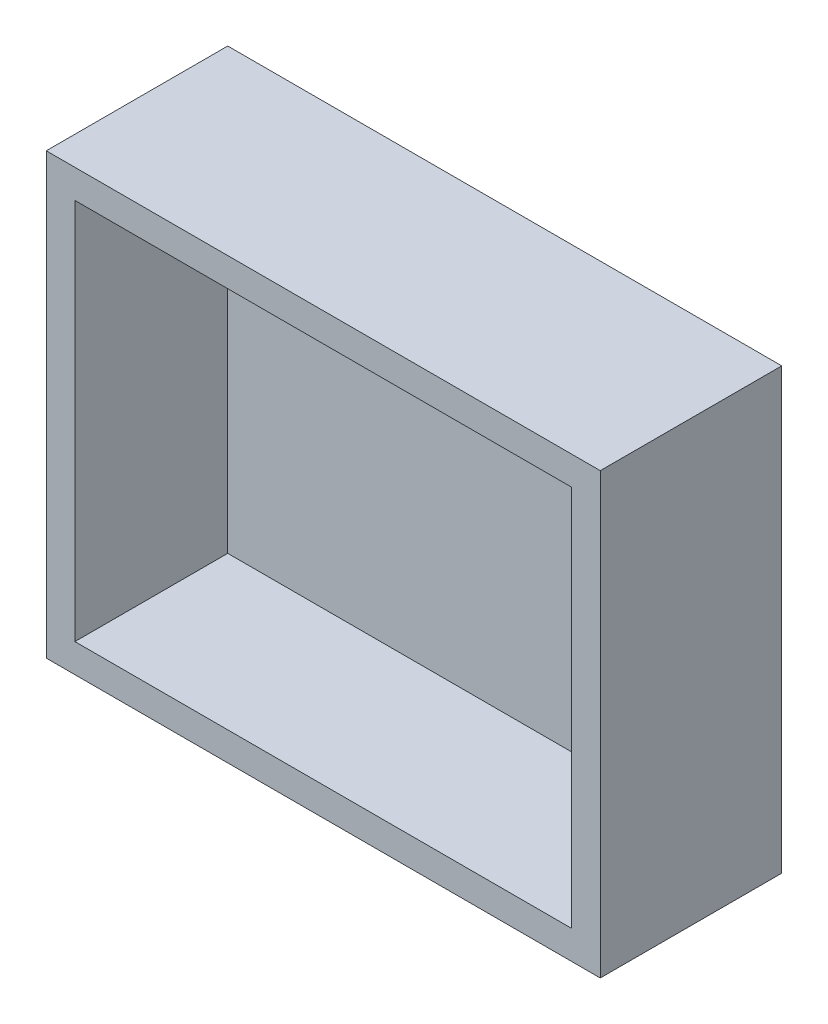
ISO-10303-21;
HEADER;
FILE_DESCRIPTION(('STEP AP214'),'2;1');
FILE_NAME('part.step','',(''),(''),'','','');
FILE_SCHEMA(('AUTOMOTIVE_DESIGN { 1 0 10303 214 1 1 1 1 }'));
ENDSEC;
DATA;
#1=APPLICATION_CONTEXT('core data for automotive mechanical design processes');
#2=APPLICATION_PROTOCOL_DEFINITION('international standard','automotive_design',2000,#1);
#3=PRODUCT_CONTEXT('',#1,'mechanical');
#4=PRODUCT('Part','Part','',(#3));
#5=PRODUCT_RELATED_PRODUCT_CATEGORY('part','',(#4));
#6=PRODUCT_DEFINITION_FORMATION('','',#4);
#7=PRODUCT_DEFINITION_CONTEXT('part definition',#1,'design');
#8=PRODUCT_DEFINITION('design','',#6,#7);
#9=PRODUCT_DEFINITION_SHAPE('','',#8);
#10=(LENGTH_UNIT() NAMED_UNIT(*) SI_UNIT(.MILLI.,.METRE.));
#11=(NAMED_UNIT(*) PLANE_ANGLE_UNIT() SI_UNIT($,.RADIAN.));
#12=(NAMED_UNIT(*) SI_UNIT($,.STERADIAN.) SOLID_ANGLE_UNIT());
#13=UNCERTAINTY_MEASURE_WITH_UNIT(LENGTH_MEASURE(1.E-05),#10,'distance_accuracy_value','');
#14=(GEOMETRIC_REPRESENTATION_CONTEXT(3) GLOBAL_UNCERTAINTY_ASSIGNED_CONTEXT((#13)) GLOBAL_UNIT_ASSIGNED_CONTEXT((#10,
#11,#12)) REPRESENTATION_CONTEXT('',''));
#15=CARTESIAN_POINT('',(0.,0.,0.));
#16=DIRECTION('',(0.,0.,1.));
#17=DIRECTION('',(1.,0.,0.));
#18=AXIS2_PLACEMENT_3D('',#15,#16,#17);
#19=CARTESIAN_POINT('',(0.,0.,80.));
#20=DIRECTION('',(0.,0.,-1.));
#21=DIRECTION('',(-1.,0.,0.));
#22=AXIS2_PLACEMENT_3D('',#19,#20,#21);
#23=PLANE('',#22);
#24=DIRECTION('',(0.,-1.,0.));
#25=VECTOR('',#24,1.);
#26=CARTESIAN_POINT('',(0.,0.,80.));
#27=LINE('',#26,#25);
#28=CARTESIAN_POINT('',(0.,230.,80.));
#29=VERTEX_POINT('',#28);
#30=CARTESIAN_POINT('',(0.,0.,80.));
#31=VERTEX_POINT('',#30);
#32=EDGE_CURVE('E151',#29,#31,#27,.T.);
#33=ORIENTED_EDGE('',*,*,#32,.T.);
#34=DIRECTION('',(1.,0.,0.));
#35=VECTOR('',#34,1.);
#36=CARTESIAN_POINT('',(0.,0.,80.));
#37=LINE('',#36,#35);
#38=CARTESIAN_POINT('',(290.,0.,80.));
#39=VERTEX_POINT('',#38);
#40=EDGE_CURVE('E154',#31,#39,#37,.T.);
#41=ORIENTED_EDGE('',*,*,#40,.T.);
#42=DIRECTION('',(0.,1.,0.));
#43=VECTOR('',#42,1.);
#44=CARTESIAN_POINT('',(290.,0.,80.));
#45=LINE('',#44,#43);
#46=CARTESIAN_POINT('',(290.,230.,80.));
#47=VERTEX_POINT('',#46);
#48=EDGE_CURVE('E105',#39,#47,#45,.T.);
#49=ORIENTED_EDGE('',*,*,#48,.T.);
#50=DIRECTION('',(-1.,0.,0.));
#51=VECTOR('',#50,1.);
#52=CARTESIAN_POINT('',(0.,230.,80.));
#53=LINE('',#52,#51);
#54=EDGE_CURVE('E157',#47,#29,#53,.T.);
#55=ORIENTED_EDGE('',*,*,#54,.T.);
#56=EDGE_LOOP('',(#33,#41,#49,#55));
#57=FACE_BOUND('',#56,.T.);
#58=DIRECTION('',(0.,-1.,0.));
#59=VECTOR('',#58,1.);
#60=CARTESIAN_POINT('',(15.,15.,80.));
#61=LINE('',#60,#59);
#62=CARTESIAN_POINT('',(15.,215.,80.));
#63=VERTEX_POINT('',#62);
#64=CARTESIAN_POINT('',(15.,15.,80.));
#65=VERTEX_POINT('',#64);
#66=EDGE_CURVE('E126',#63,#65,#61,.T.);
#67=ORIENTED_EDGE('',*,*,#66,.F.);
#68=DIRECTION('',(-1.,0.,0.));
#69=VECTOR('',#68,1.);
#70=CARTESIAN_POINT('',(15.,215.,80.));
#71=LINE('',#70,#69);
#72=CARTESIAN_POINT('',(275.,215.,80.));
#73=VERTEX_POINT('',#72);
#74=EDGE_CURVE('E133',#73,#63,#71,.T.);
#75=ORIENTED_EDGE('',*,*,#74,.F.);
#76=DIRECTION('',(0.,1.,0.));
#77=VECTOR('',#76,1.);
#78=CARTESIAN_POINT('',(275.,15.,80.));
#79=LINE('',#78,#77);
#80=CARTESIAN_POINT('',(275.,15.,80.));
#81=VERTEX_POINT('',#80);
#82=EDGE_CURVE('E131',#81,#73,#79,.T.);
#83=ORIENTED_EDGE('',*,*,#82,.F.);
#84=DIRECTION('',(1.,0.,0.));
#85=VECTOR('',#84,1.);
#86=CARTESIAN_POINT('',(15.,15.,80.));
#87=LINE('',#86,#85);
#88=EDGE_CURVE('E128',#65,#81,#87,.T.);
#89=ORIENTED_EDGE('',*,*,#88,.F.);
#90=EDGE_LOOP('',(#67,#75,#83,#89));
#91=FACE_BOUND('',#90,.T.);
#92=ADVANCED_FACE('F34',(#57,#91),#23,.F.);
#93=CARTESIAN_POINT('',(0.,0.,80.));
#94=DIRECTION('',(1.,0.,0.));
#95=DIRECTION('',(0.,0.,-1.));
#96=AXIS2_PLACEMENT_3D('',#93,#94,#95);
#97=PLANE('',#96);
#98=DIRECTION('',(0.,0.,-1.));
#99=VECTOR('',#98,1.);
#100=CARTESIAN_POINT('',(0.,230.,80.));
#101=LINE('',#100,#99);
#102=CARTESIAN_POINT('',(0.,230.,-15.));
#103=VERTEX_POINT('',#102);
#104=EDGE_CURVE('E159',#29,#103,#101,.T.);
#105=ORIENTED_EDGE('',*,*,#104,.T.);
#106=DIRECTION('',(0.,1.,0.));
#107=VECTOR('',#106,1.);
#108=CARTESIAN_POINT('',(0.,0.,-15.));
#109=LINE('',#108,#107);
#110=CARTESIAN_POINT('',(0.,0.,-15.));
#111=VERTEX_POINT('',#110);
#112=EDGE_CURVE('E124',#111,#103,#109,.T.);
#113=ORIENTED_EDGE('',*,*,#112,.F.);
#114=DIRECTION('',(0.,0.,-1.));
#115=VECTOR('',#114,1.);
#116=CARTESIAN_POINT('',(0.,0.,80.));
#117=LINE('',#116,#115);
#118=EDGE_CURVE('E11',#31,#111,#117,.T.);
#119=ORIENTED_EDGE('',*,*,#118,.F.);
#120=ORIENTED_EDGE('',*,*,#32,.F.);
#121=EDGE_LOOP('',(#105,#113,#119,#120));
#122=FACE_BOUND('',#121,.T.);
#123=ADVANCED_FACE('F36',(#122),#97,.F.);
#124=CARTESIAN_POINT('',(0.,0.,80.));
#125=DIRECTION('',(0.,1.,0.));
#126=DIRECTION('',(0.,0.,1.));
#127=AXIS2_PLACEMENT_3D('',#124,#125,#126);
#128=PLANE('',#127);
#129=ORIENTED_EDGE('',*,*,#118,.T.);
#130=DIRECTION('',(1.,0.,0.));
#131=VECTOR('',#130,1.);
#132=CARTESIAN_POINT('',(0.,0.,-15.));
#133=LINE('',#132,#131);
#134=CARTESIAN_POINT('',(290.,0.,-15.));
#135=VERTEX_POINT('',#134);
#136=EDGE_CURVE('E114',#111,#135,#133,.T.);
#137=ORIENTED_EDGE('',*,*,#136,.T.);
#138=DIRECTION('',(0.,0.,-1.));
#139=VECTOR('',#138,1.);
#140=CARTESIAN_POINT('',(290.,0.,80.));
#141=LINE('',#140,#139);
#142=EDGE_CURVE('E42',#39,#135,#141,.T.);
#143=ORIENTED_EDGE('',*,*,#142,.F.);
#144=ORIENTED_EDGE('',*,*,#40,.F.);
#145=EDGE_LOOP('',(#129,#137,#143,#144));
#146=FACE_BOUND('',#145,.T.);
#147=ADVANCED_FACE('F118',(#146),#128,.F.);
#148=CARTESIAN_POINT('',(290.,0.,80.));
#149=DIRECTION('',(-1.,0.,0.));
#150=DIRECTION('',(0.,0.,1.));
#151=AXIS2_PLACEMENT_3D('',#148,#149,#150);
#152=PLANE('',#151);
#153=ORIENTED_EDGE('',*,*,#142,.T.);
#154=DIRECTION('',(0.,1.,0.));
#155=VECTOR('',#154,1.);
#156=CARTESIAN_POINT('',(290.,0.,-15.));
#157=LINE('',#156,#155);
#158=CARTESIAN_POINT('',(290.,230.,-15.));
#159=VERTEX_POINT('',#158);
#160=EDGE_CURVE('E104',#135,#159,#157,.T.);
#161=ORIENTED_EDGE('',*,*,#160,.T.);
#162=DIRECTION('',(0.,0.,-1.));
#163=VECTOR('',#162,1.);
#164=CARTESIAN_POINT('',(290.,230.,80.));
#165=LINE('',#164,#163);
#166=EDGE_CURVE('E108',#47,#159,#165,.T.);
#167=ORIENTED_EDGE('',*,*,#166,.F.);
#168=ORIENTED_EDGE('',*,*,#48,.F.);
#169=EDGE_LOOP('',(#153,#161,#167,#168));
#170=FACE_BOUND('',#169,.T.);
#171=ADVANCED_FACE('F102',(#170),#152,.F.);
#172=CARTESIAN_POINT('',(0.,230.,80.));
#173=DIRECTION('',(0.,-1.,0.));
#174=DIRECTION('',(0.,0.,-1.));
#175=AXIS2_PLACEMENT_3D('',#172,#173,#174);
#176=PLANE('',#175);
#177=ORIENTED_EDGE('',*,*,#166,.T.);
#178=DIRECTION('',(1.,0.,0.));
#179=VECTOR('',#178,1.);
#180=CARTESIAN_POINT('',(0.,230.,-15.));
#181=LINE('',#180,#179);
#182=EDGE_CURVE('E116',#103,#159,#181,.T.);
#183=ORIENTED_EDGE('',*,*,#182,.F.);
#184=ORIENTED_EDGE('',*,*,#104,.F.);
#185=ORIENTED_EDGE('',*,*,#54,.F.);
#186=EDGE_LOOP('',(#177,#183,#184,#185));
#187=FACE_BOUND('',#186,.T.);
#188=ADVANCED_FACE('F163',(#187),#176,.F.);
#189=CARTESIAN_POINT('',(15.,15.,80.));
#190=DIRECTION('',(1.,0.,0.));
#191=DIRECTION('',(0.,0.,-1.));
#192=AXIS2_PLACEMENT_3D('',#189,#190,#191);
#193=PLANE('',#192);
#194=DIRECTION('',(0.,-1.,0.));
#195=VECTOR('',#194,1.);
#196=CARTESIAN_POINT('',(15.,15.,0.));
#197=LINE('',#196,#195);
#198=CARTESIAN_POINT('',(15.,215.,0.));
#199=VERTEX_POINT('',#198);
#200=CARTESIAN_POINT('',(15.,15.,0.));
#201=VERTEX_POINT('',#200);
#202=EDGE_CURVE('E57',#199,#201,#197,.T.);
#203=ORIENTED_EDGE('',*,*,#202,.F.);
#204=DIRECTION('',(0.,0.,-1.));
#205=VECTOR('',#204,1.);
#206=CARTESIAN_POINT('',(15.,215.,80.));
#207=LINE('',#206,#205);
#208=EDGE_CURVE('E135',#63,#199,#207,.T.);
#209=ORIENTED_EDGE('',*,*,#208,.F.);
#210=ORIENTED_EDGE('',*,*,#66,.T.);
#211=DIRECTION('',(0.,0.,-1.));
#212=VECTOR('',#211,1.);
#213=CARTESIAN_POINT('',(15.,15.,80.));
#214=LINE('',#213,#212);
#215=EDGE_CURVE('E149',#65,#201,#214,.T.);
#216=ORIENTED_EDGE('',*,*,#215,.T.);
#217=EDGE_LOOP('',(#203,#209,#210,#216));
#218=FACE_BOUND('',#217,.T.);
#219=ADVANCED_FACE('F179',(#218),#193,.T.);
#220=CARTESIAN_POINT('',(15.,15.,80.));
#221=DIRECTION('',(0.,1.,0.));
#222=DIRECTION('',(0.,0.,1.));
#223=AXIS2_PLACEMENT_3D('',#220,#221,#222);
#224=PLANE('',#223);
#225=DIRECTION('',(1.,0.,0.));
#226=VECTOR('',#225,1.);
#227=CARTESIAN_POINT('',(15.,15.,0.));
#228=LINE('',#227,#226);
#229=CARTESIAN_POINT('',(275.,15.,0.));
#230=VERTEX_POINT('',#229);
#231=EDGE_CURVE('E137',#201,#230,#228,.T.);
#232=ORIENTED_EDGE('',*,*,#231,.F.);
#233=ORIENTED_EDGE('',*,*,#215,.F.);
#234=ORIENTED_EDGE('',*,*,#88,.T.);
#235=DIRECTION('',(0.,0.,-1.));
#236=VECTOR('',#235,1.);
#237=CARTESIAN_POINT('',(275.,15.,80.));
#238=LINE('',#237,#236);
#239=EDGE_CURVE('E147',#81,#230,#238,.T.);
#240=ORIENTED_EDGE('',*,*,#239,.T.);
#241=EDGE_LOOP('',(#232,#233,#234,#240));
#242=FACE_BOUND('',#241,.T.);
#243=ADVANCED_FACE('F198',(#242),#224,.T.);
#244=CARTESIAN_POINT('',(275.,15.,80.));
#245=DIRECTION('',(-1.,0.,0.));
#246=DIRECTION('',(0.,0.,1.));
#247=AXIS2_PLACEMENT_3D('',#244,#245,#246);
#248=PLANE('',#247);
#249=DIRECTION('',(0.,1.,0.));
#250=VECTOR('',#249,1.);
#251=CARTESIAN_POINT('',(275.,15.,0.));
#252=LINE('',#251,#250);
#253=CARTESIAN_POINT('',(275.,215.,0.));
#254=VERTEX_POINT('',#253);
#255=EDGE_CURVE('E140',#230,#254,#252,.T.);
#256=ORIENTED_EDGE('',*,*,#255,.F.);
#257=ORIENTED_EDGE('',*,*,#239,.F.);
#258=ORIENTED_EDGE('',*,*,#82,.T.);
#259=DIRECTION('',(0.,0.,-1.));
#260=VECTOR('',#259,1.);
#261=CARTESIAN_POINT('',(275.,215.,80.));
#262=LINE('',#261,#260);
#263=EDGE_CURVE('E49',#73,#254,#262,.T.);
#264=ORIENTED_EDGE('',*,*,#263,.T.);
#265=EDGE_LOOP('',(#256,#257,#258,#264));
#266=FACE_BOUND('',#265,.T.);
#267=ADVANCED_FACE('F204',(#266),#248,.T.);
#268=CARTESIAN_POINT('',(15.,215.,80.));
#269=DIRECTION('',(0.,-1.,0.));
#270=DIRECTION('',(0.,0.,-1.));
#271=AXIS2_PLACEMENT_3D('',#268,#269,#270);
#272=PLANE('',#271);
#273=DIRECTION('',(-1.,0.,0.));
#274=VECTOR('',#273,1.);
#275=CARTESIAN_POINT('',(15.,215.,0.));
#276=LINE('',#275,#274);
#277=EDGE_CURVE('E129',#254,#199,#276,.T.);
#278=ORIENTED_EDGE('',*,*,#277,.F.);
#279=ORIENTED_EDGE('',*,*,#263,.F.);
#280=ORIENTED_EDGE('',*,*,#74,.T.);
#281=ORIENTED_EDGE('',*,*,#208,.T.);
#282=EDGE_LOOP('',(#278,#279,#280,#281));
#283=FACE_BOUND('',#282,.T.);
#284=ADVANCED_FACE('F211',(#283),#272,.T.);
#285=CARTESIAN_POINT('',(0.,0.,0.));
#286=DIRECTION('',(0.,0.,1.));
#287=DIRECTION('',(1.,0.,0.));
#288=AXIS2_PLACEMENT_3D('',#285,#286,#287);
#289=PLANE('',#288);
#290=ORIENTED_EDGE('',*,*,#255,.T.);
#291=ORIENTED_EDGE('',*,*,#277,.T.);
#292=ORIENTED_EDGE('',*,*,#202,.T.);
#293=ORIENTED_EDGE('',*,*,#231,.T.);
#294=EDGE_LOOP('',(#290,#291,#292,#293));
#295=FACE_BOUND('',#294,.T.);
#296=ADVANCED_FACE('F219',(#295),#289,.T.);
#297=CARTESIAN_POINT('',(0.,0.,-15.));
#298=DIRECTION('',(0.,0.,1.));
#299=DIRECTION('',(1.,0.,0.));
#300=AXIS2_PLACEMENT_3D('',#297,#298,#299);
#301=PLANE('',#300);
#302=ORIENTED_EDGE('',*,*,#136,.F.);
#303=ORIENTED_EDGE('',*,*,#112,.T.);
#304=ORIENTED_EDGE('',*,*,#182,.T.);
#305=ORIENTED_EDGE('',*,*,#160,.F.);
#306=EDGE_LOOP('',(#302,#303,#304,#305));
#307=FACE_BOUND('',#306,.T.);
#308=ADVANCED_FACE('F112',(#307),#301,.F.);
#309=CLOSED_SHELL('',(#92,#123,#147,#171,#188,#219,#243,#267,#284,#296,#308));
#310=MANIFOLD_SOLID_BREP('B2',#309);
#311=ADVANCED_BREP_SHAPE_REPRESENTATION('',(#18,#310),#14);
#312=SHAPE_DEFINITION_REPRESENTATION(#9,#311);
ENDSEC;
END-ISO-10303-21;
